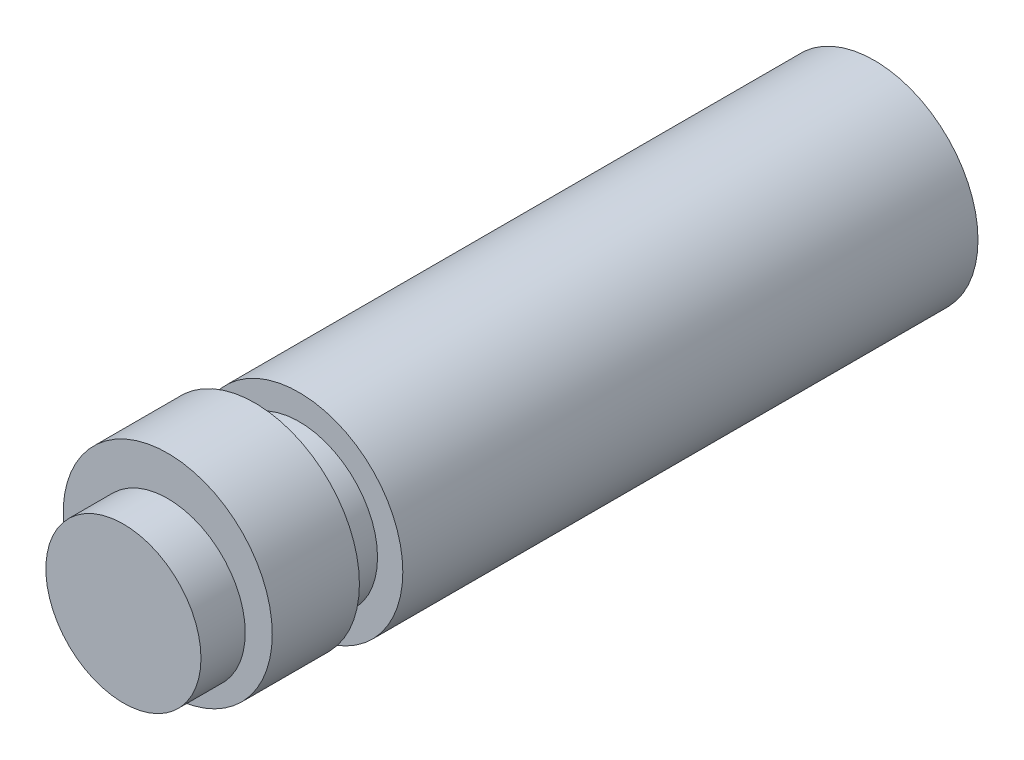
ISO-10303-21;
HEADER;
FILE_DESCRIPTION(('STEP AP214'),'2;1');
FILE_NAME('part.step','',(''),(''),'','','');
FILE_SCHEMA(('AUTOMOTIVE_DESIGN { 1 0 10303 214 1 1 1 1 }'));
ENDSEC;
DATA;
#1=APPLICATION_CONTEXT('core data for automotive mechanical design processes');
#2=APPLICATION_PROTOCOL_DEFINITION('international standard','automotive_design',2000,#1);
#3=PRODUCT_CONTEXT('',#1,'mechanical');
#4=PRODUCT('Part','Part','',(#3));
#5=PRODUCT_RELATED_PRODUCT_CATEGORY('part','',(#4));
#6=PRODUCT_DEFINITION_FORMATION('','',#4);
#7=PRODUCT_DEFINITION_CONTEXT('part definition',#1,'design');
#8=PRODUCT_DEFINITION('design','',#6,#7);
#9=PRODUCT_DEFINITION_SHAPE('','',#8);
#10=(LENGTH_UNIT() NAMED_UNIT(*) SI_UNIT(.MILLI.,.METRE.));
#11=(NAMED_UNIT(*) PLANE_ANGLE_UNIT() SI_UNIT($,.RADIAN.));
#12=(NAMED_UNIT(*) SI_UNIT($,.STERADIAN.) SOLID_ANGLE_UNIT());
#13=UNCERTAINTY_MEASURE_WITH_UNIT(LENGTH_MEASURE(1.E-05),#10,'distance_accuracy_value','');
#14=(GEOMETRIC_REPRESENTATION_CONTEXT(3) GLOBAL_UNCERTAINTY_ASSIGNED_CONTEXT((#13)) GLOBAL_UNIT_ASSIGNED_CONTEXT((#10,
#11,#12)) REPRESENTATION_CONTEXT('',''));
#15=CARTESIAN_POINT('',(0.,0.,0.));
#16=DIRECTION('',(0.,0.,1.));
#17=DIRECTION('',(1.,0.,0.));
#18=AXIS2_PLACEMENT_3D('',#15,#16,#17);
#19=CARTESIAN_POINT('',(0.,0.,0.));
#20=DIRECTION('',(0.,0.,1.));
#21=DIRECTION('',(1.,0.,0.));
#22=AXIS2_PLACEMENT_3D('',#19,#20,#21);
#23=PLANE('',#22);
#24=CARTESIAN_POINT('',(0.,0.,0.));
#25=DIRECTION('',(0.,0.,1.));
#26=DIRECTION('',(1.,0.,0.));
#27=AXIS2_PLACEMENT_3D('',#24,#25,#26);
#28=CIRCLE('',#27,5.95);
#29=CARTESIAN_POINT('',(5.95,0.,0.));
#30=VERTEX_POINT('',#29);
#31=EDGE_CURVE('E51',#30,#30,#28,.T.);
#32=ORIENTED_EDGE('',*,*,#31,.F.);
#33=EDGE_LOOP('',(#32));
#34=FACE_BOUND('',#33,.T.);
#35=DIRECTION('',(0.,1.,0.));
#36=VECTOR('',#35,1.);
#37=CARTESIAN_POINT('',(1.075,0.,0.));
#38=LINE('',#37,#36);
#39=CARTESIAN_POINT('',(1.075,3.98246155034797,0.));
#40=VERTEX_POINT('',#39);
#41=CARTESIAN_POINT('',(1.075,5.09246155034798,0.));
#42=VERTEX_POINT('',#41);
#43=EDGE_CURVE('E65',#40,#42,#38,.T.);
#44=ORIENTED_EDGE('',*,*,#43,.T.);
#45=DIRECTION('',(-1.,0.,0.));
#46=VECTOR('',#45,1.);
#47=CARTESIAN_POINT('',(0.,5.09246155034797,0.));
#48=LINE('',#47,#46);
#49=CARTESIAN_POINT('',(-1.075,5.09246155034797,0.));
#50=VERTEX_POINT('',#49);
#51=EDGE_CURVE('E91',#42,#50,#48,.T.);
#52=ORIENTED_EDGE('',*,*,#51,.T.);
#53=DIRECTION('',(0.,1.,0.));
#54=VECTOR('',#53,1.);
#55=CARTESIAN_POINT('',(-1.075,0.,0.));
#56=LINE('',#55,#54);
#57=CARTESIAN_POINT('',(-1.075,3.98246155034797,0.));
#58=VERTEX_POINT('',#57);
#59=EDGE_CURVE('E129',#58,#50,#56,.T.);
#60=ORIENTED_EDGE('',*,*,#59,.F.);
#61=CARTESIAN_POINT('',(0.,0.,0.));
#62=DIRECTION('',(0.,0.,-1.));
#63=DIRECTION('',(-1.,0.,0.));
#64=AXIS2_PLACEMENT_3D('',#61,#62,#63);
#65=CIRCLE('',#64,4.125);
#66=EDGE_CURVE('E104',#40,#58,#65,.T.);
#67=ORIENTED_EDGE('',*,*,#66,.F.);
#68=EDGE_LOOP('',(#44,#52,#60,#67));
#69=FACE_BOUND('',#68,.T.);
#70=ADVANCED_FACE('F47',(#34,#69),#23,.F.);
#71=CARTESIAN_POINT('',(0.,0.,33.));
#72=DIRECTION('',(0.,0.,-1.));
#73=DIRECTION('',(-1.,0.,0.));
#74=AXIS2_PLACEMENT_3D('',#71,#72,#73);
#75=CYLINDRICAL_SURFACE('',#74,5.95);
#76=CARTESIAN_POINT('',(0.,0.,33.));
#77=DIRECTION('',(0.,0.,1.));
#78=DIRECTION('',(1.,0.,0.));
#79=AXIS2_PLACEMENT_3D('',#76,#77,#78);
#80=CIRCLE('',#79,5.95);
#81=CARTESIAN_POINT('',(5.95,0.,33.));
#82=VERTEX_POINT('',#81);
#83=EDGE_CURVE('E159',#82,#82,#80,.T.);
#84=ORIENTED_EDGE('',*,*,#83,.F.);
#85=EDGE_LOOP('',(#84));
#86=FACE_BOUND('',#85,.T.);
#87=ORIENTED_EDGE('',*,*,#31,.T.);
#88=EDGE_LOOP('',(#87));
#89=FACE_BOUND('',#88,.T.);
#90=ADVANCED_FACE('F49',(#86,#89),#75,.T.);
#91=CARTESIAN_POINT('',(0.,0.,33.));
#92=DIRECTION('',(0.,0.,1.));
#93=DIRECTION('',(1.,0.,0.));
#94=AXIS2_PLACEMENT_3D('',#91,#92,#93);
#95=PLANE('',#94);
#96=CARTESIAN_POINT('',(0.,0.,33.));
#97=DIRECTION('',(0.,0.,1.));
#98=DIRECTION('',(1.,0.,0.));
#99=AXIS2_PLACEMENT_3D('',#96,#97,#98);
#100=CIRCLE('',#99,4.5);
#101=CARTESIAN_POINT('',(4.5,0.,33.));
#102=VERTEX_POINT('',#101);
#103=EDGE_CURVE('E57',#102,#102,#100,.T.);
#104=ORIENTED_EDGE('',*,*,#103,.F.);
#105=EDGE_LOOP('',(#104));
#106=FACE_BOUND('',#105,.T.);
#107=ORIENTED_EDGE('',*,*,#83,.T.);
#108=EDGE_LOOP('',(#107));
#109=FACE_BOUND('',#108,.T.);
#110=ADVANCED_FACE('F176',(#106,#109),#95,.T.);
#111=CARTESIAN_POINT('',(0.,0.,35.54));
#112=DIRECTION('',(0.,0.,-1.));
#113=DIRECTION('',(-1.,0.,0.));
#114=AXIS2_PLACEMENT_3D('',#111,#112,#113);
#115=CYLINDRICAL_SURFACE('',#114,4.5);
#116=CARTESIAN_POINT('',(0.,0.,35.54));
#117=DIRECTION('',(0.,0.,1.));
#118=DIRECTION('',(1.,0.,0.));
#119=AXIS2_PLACEMENT_3D('',#116,#117,#118);
#120=CIRCLE('',#119,4.5);
#121=CARTESIAN_POINT('',(4.5,0.,35.54));
#122=VERTEX_POINT('',#121);
#123=EDGE_CURVE('E150',#122,#122,#120,.T.);
#124=ORIENTED_EDGE('',*,*,#123,.F.);
#125=EDGE_LOOP('',(#124));
#126=FACE_BOUND('',#125,.T.);
#127=ORIENTED_EDGE('',*,*,#103,.T.);
#128=EDGE_LOOP('',(#127));
#129=FACE_BOUND('',#128,.T.);
#130=ADVANCED_FACE('F181',(#126,#129),#115,.T.);
#131=CARTESIAN_POINT('',(0.,0.7,40.54));
#132=DIRECTION('',(0.,0.,-1.));
#133=DIRECTION('',(-1.,0.,0.));
#134=AXIS2_PLACEMENT_3D('',#131,#132,#133);
#135=CYLINDRICAL_SURFACE('',#134,6.);
#136=CARTESIAN_POINT('',(0.,0.7,40.54));
#137=DIRECTION('',(0.,0.,1.));
#138=DIRECTION('',(1.,0.,0.));
#139=AXIS2_PLACEMENT_3D('',#136,#137,#138);
#140=CIRCLE('',#139,6.);
#141=CARTESIAN_POINT('',(6.,0.7,40.54));
#142=VERTEX_POINT('',#141);
#143=EDGE_CURVE('E146',#142,#142,#140,.T.);
#144=ORIENTED_EDGE('',*,*,#143,.F.);
#145=EDGE_LOOP('',(#144));
#146=FACE_BOUND('',#145,.T.);
#147=CARTESIAN_POINT('',(0.,0.7,35.54));
#148=DIRECTION('',(0.,0.,1.));
#149=DIRECTION('',(1.,0.,0.));
#150=AXIS2_PLACEMENT_3D('',#147,#148,#149);
#151=CIRCLE('',#150,6.);
#152=CARTESIAN_POINT('',(6.,0.7,35.54));
#153=VERTEX_POINT('',#152);
#154=EDGE_CURVE('E144',#153,#153,#151,.T.);
#155=ORIENTED_EDGE('',*,*,#154,.T.);
#156=EDGE_LOOP('',(#155));
#157=FACE_BOUND('',#156,.T.);
#158=ADVANCED_FACE('F185',(#146,#157),#135,.T.);
#159=CARTESIAN_POINT('',(0.,0.,40.54));
#160=DIRECTION('',(0.,0.,1.));
#161=DIRECTION('',(1.,0.,0.));
#162=AXIS2_PLACEMENT_3D('',#159,#160,#161);
#163=PLANE('',#162);
#164=CARTESIAN_POINT('',(0.,0.,40.54));
#165=DIRECTION('',(0.,0.,1.));
#166=DIRECTION('',(1.,0.,0.));
#167=AXIS2_PLACEMENT_3D('',#164,#165,#166);
#168=CIRCLE('',#167,4.45);
#169=CARTESIAN_POINT('',(4.45,0.,40.54));
#170=VERTEX_POINT('',#169);
#171=EDGE_CURVE('E11',#170,#170,#168,.T.);
#172=ORIENTED_EDGE('',*,*,#171,.F.);
#173=EDGE_LOOP('',(#172));
#174=FACE_BOUND('',#173,.T.);
#175=ORIENTED_EDGE('',*,*,#143,.T.);
#176=EDGE_LOOP('',(#175));
#177=FACE_BOUND('',#176,.T.);
#178=ADVANCED_FACE('F189',(#174,#177),#163,.T.);
#179=CARTESIAN_POINT('',(0.,0.,35.54));
#180=DIRECTION('',(0.,0.,1.));
#181=DIRECTION('',(1.,0.,0.));
#182=AXIS2_PLACEMENT_3D('',#179,#180,#181);
#183=PLANE('',#182);
#184=ORIENTED_EDGE('',*,*,#123,.T.);
#185=EDGE_LOOP('',(#184));
#186=FACE_BOUND('',#185,.T.);
#187=ORIENTED_EDGE('',*,*,#154,.F.);
#188=EDGE_LOOP('',(#187));
#189=FACE_BOUND('',#188,.T.);
#190=ADVANCED_FACE('F191',(#186,#189),#183,.F.);
#191=CARTESIAN_POINT('',(0.,0.,43.08));
#192=DIRECTION('',(0.,0.,-1.));
#193=DIRECTION('',(-1.,0.,0.));
#194=AXIS2_PLACEMENT_3D('',#191,#192,#193);
#195=CYLINDRICAL_SURFACE('',#194,4.45);
#196=CARTESIAN_POINT('',(0.,0.,43.08));
#197=DIRECTION('',(0.,0.,1.));
#198=DIRECTION('',(1.,0.,0.));
#199=AXIS2_PLACEMENT_3D('',#196,#197,#198);
#200=CIRCLE('',#199,4.45);
#201=CARTESIAN_POINT('',(4.45,0.,43.08));
#202=VERTEX_POINT('',#201);
#203=EDGE_CURVE('E137',#202,#202,#200,.T.);
#204=ORIENTED_EDGE('',*,*,#203,.F.);
#205=EDGE_LOOP('',(#204));
#206=FACE_BOUND('',#205,.T.);
#207=ORIENTED_EDGE('',*,*,#171,.T.);
#208=EDGE_LOOP('',(#207));
#209=FACE_BOUND('',#208,.T.);
#210=ADVANCED_FACE('F194',(#206,#209),#195,.T.);
#211=CARTESIAN_POINT('',(0.,0.,43.08));
#212=DIRECTION('',(0.,0.,1.));
#213=DIRECTION('',(1.,0.,0.));
#214=AXIS2_PLACEMENT_3D('',#211,#212,#213);
#215=PLANE('',#214);
#216=ORIENTED_EDGE('',*,*,#203,.T.);
#217=EDGE_LOOP('',(#216));
#218=FACE_BOUND('',#217,.T.);
#219=ADVANCED_FACE('F201',(#218),#215,.T.);
#220=CARTESIAN_POINT('',(1.075,0.,31.5));
#221=DIRECTION('',(-1.,0.,0.));
#222=DIRECTION('',(0.,0.,1.));
#223=AXIS2_PLACEMENT_3D('',#220,#221,#222);
#224=PLANE('',#223);
#225=ORIENTED_EDGE('',*,*,#43,.F.);
#226=DIRECTION('',(0.,0.,-1.));
#227=VECTOR('',#226,1.);
#228=CARTESIAN_POINT('',(1.075,3.98246155034797,31.5));
#229=LINE('',#228,#227);
#230=CARTESIAN_POINT('',(1.075,3.98246155034797,31.5));
#231=VERTEX_POINT('',#230);
#232=EDGE_CURVE('E93',#231,#40,#229,.T.);
#233=ORIENTED_EDGE('',*,*,#232,.F.);
#234=DIRECTION('',(0.,1.,0.));
#235=VECTOR('',#234,1.);
#236=CARTESIAN_POINT('',(1.075,0.,31.5));
#237=LINE('',#236,#235);
#238=CARTESIAN_POINT('',(1.075,5.09246155034798,31.5));
#239=VERTEX_POINT('',#238);
#240=EDGE_CURVE('E117',#231,#239,#237,.T.);
#241=ORIENTED_EDGE('',*,*,#240,.T.);
#242=DIRECTION('',(0.,0.,-1.));
#243=VECTOR('',#242,1.);
#244=CARTESIAN_POINT('',(1.075,5.09246155034798,31.5));
#245=LINE('',#244,#243);
#246=EDGE_CURVE('E134',#239,#42,#245,.T.);
#247=ORIENTED_EDGE('',*,*,#246,.T.);
#248=EDGE_LOOP('',(#225,#233,#241,#247));
#249=FACE_BOUND('',#248,.T.);
#250=ADVANCED_FACE('F204',(#249),#224,.T.);
#251=CARTESIAN_POINT('',(0.,5.09246155034797,31.5));
#252=DIRECTION('',(0.,-1.,0.));
#253=DIRECTION('',(1.,0.,0.));
#254=AXIS2_PLACEMENT_3D('',#251,#252,#253);
#255=PLANE('',#254);
#256=ORIENTED_EDGE('',*,*,#51,.F.);
#257=ORIENTED_EDGE('',*,*,#246,.F.);
#258=DIRECTION('',(-1.,0.,0.));
#259=VECTOR('',#258,1.);
#260=CARTESIAN_POINT('',(0.,5.09246155034797,31.5));
#261=LINE('',#260,#259);
#262=CARTESIAN_POINT('',(-1.075,5.09246155034797,31.5));
#263=VERTEX_POINT('',#262);
#264=EDGE_CURVE('E74',#239,#263,#261,.T.);
#265=ORIENTED_EDGE('',*,*,#264,.T.);
#266=DIRECTION('',(0.,0.,-1.));
#267=VECTOR('',#266,1.);
#268=CARTESIAN_POINT('',(-1.075,5.09246155034797,31.5));
#269=LINE('',#268,#267);
#270=EDGE_CURVE('E109',#263,#50,#269,.T.);
#271=ORIENTED_EDGE('',*,*,#270,.T.);
#272=EDGE_LOOP('',(#256,#257,#265,#271));
#273=FACE_BOUND('',#272,.T.);
#274=ADVANCED_FACE('F207',(#273),#255,.T.);
#275=CARTESIAN_POINT('',(-1.075,0.,31.5));
#276=DIRECTION('',(-1.,0.,0.));
#277=DIRECTION('',(0.,0.,1.));
#278=AXIS2_PLACEMENT_3D('',#275,#276,#277);
#279=PLANE('',#278);
#280=ORIENTED_EDGE('',*,*,#59,.T.);
#281=ORIENTED_EDGE('',*,*,#270,.F.);
#282=DIRECTION('',(0.,1.,0.));
#283=VECTOR('',#282,1.);
#284=CARTESIAN_POINT('',(-1.075,0.,31.5));
#285=LINE('',#284,#283);
#286=CARTESIAN_POINT('',(-1.075,3.98246155034797,31.5));
#287=VERTEX_POINT('',#286);
#288=EDGE_CURVE('E112',#287,#263,#285,.T.);
#289=ORIENTED_EDGE('',*,*,#288,.F.);
#290=DIRECTION('',(0.,0.,-1.));
#291=VECTOR('',#290,1.);
#292=CARTESIAN_POINT('',(-1.075,3.98246155034797,31.5));
#293=LINE('',#292,#291);
#294=EDGE_CURVE('E98',#287,#58,#293,.T.);
#295=ORIENTED_EDGE('',*,*,#294,.T.);
#296=EDGE_LOOP('',(#280,#281,#289,#295));
#297=FACE_BOUND('',#296,.T.);
#298=ADVANCED_FACE('F113',(#297),#279,.F.);
#299=CARTESIAN_POINT('',(0.,0.,31.5));
#300=DIRECTION('',(0.,0.,-1.));
#301=DIRECTION('',(-1.,0.,0.));
#302=AXIS2_PLACEMENT_3D('',#299,#300,#301);
#303=CYLINDRICAL_SURFACE('',#302,4.125);
#304=ORIENTED_EDGE('',*,*,#66,.T.);
#305=ORIENTED_EDGE('',*,*,#294,.F.);
#306=CARTESIAN_POINT('',(0.,0.,31.5));
#307=DIRECTION('',(0.,0.,-1.));
#308=DIRECTION('',(-1.,0.,0.));
#309=AXIS2_PLACEMENT_3D('',#306,#307,#308);
#310=CIRCLE('',#309,4.125);
#311=EDGE_CURVE('E102',#231,#287,#310,.T.);
#312=ORIENTED_EDGE('',*,*,#311,.F.);
#313=ORIENTED_EDGE('',*,*,#232,.T.);
#314=EDGE_LOOP('',(#304,#305,#312,#313));
#315=FACE_BOUND('',#314,.T.);
#316=ADVANCED_FACE('F100',(#315),#303,.F.);
#317=CARTESIAN_POINT('',(0.,0.,31.5));
#318=DIRECTION('',(0.,0.,-1.));
#319=DIRECTION('',(-1.,0.,0.));
#320=AXIS2_PLACEMENT_3D('',#317,#318,#319);
#321=PLANE('',#320);
#322=ORIENTED_EDGE('',*,*,#240,.F.);
#323=ORIENTED_EDGE('',*,*,#311,.T.);
#324=ORIENTED_EDGE('',*,*,#288,.T.);
#325=ORIENTED_EDGE('',*,*,#264,.F.);
#326=EDGE_LOOP('',(#322,#323,#324,#325));
#327=FACE_BOUND('',#326,.T.);
#328=ADVANCED_FACE('F116',(#327),#321,.T.);
#329=CLOSED_SHELL('',(#70,#90,#110,#130,#158,#178,#190,#210,#219,#250,#274,#298,#316,#328));
#330=MANIFOLD_SOLID_BREP('B2',#329);
#331=ADVANCED_BREP_SHAPE_REPRESENTATION('',(#18,#330),#14);
#332=SHAPE_DEFINITION_REPRESENTATION(#9,#331);
ENDSEC;
END-ISO-10303-21;
